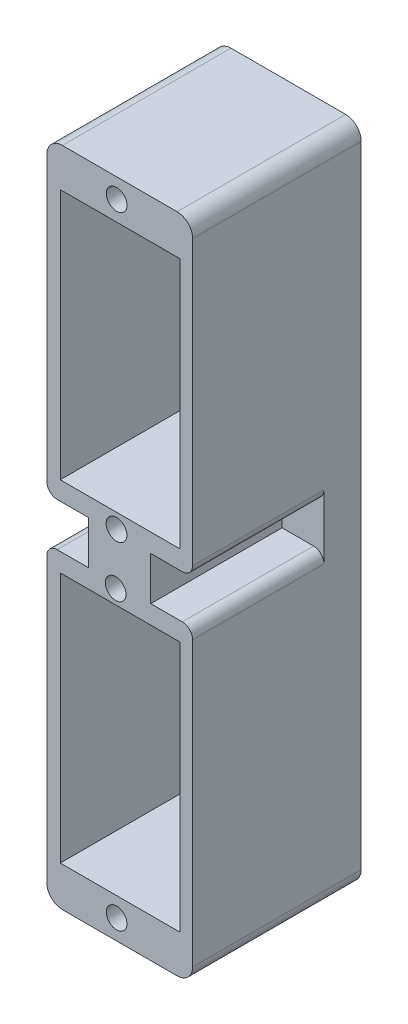
ISO-10303-21;
HEADER;
FILE_DESCRIPTION(('STEP AP214'),'2;1');
FILE_NAME('part.step','',(''),(''),'','','');
FILE_SCHEMA(('AUTOMOTIVE_DESIGN { 1 0 10303 214 1 1 1 1 }'));
ENDSEC;
DATA;
#1=APPLICATION_CONTEXT('core data for automotive mechanical design processes');
#2=APPLICATION_PROTOCOL_DEFINITION('international standard','automotive_design',2000,#1);
#3=PRODUCT_CONTEXT('',#1,'mechanical');
#4=PRODUCT('Part','Part','',(#3));
#5=PRODUCT_RELATED_PRODUCT_CATEGORY('part','',(#4));
#6=PRODUCT_DEFINITION_FORMATION('','',#4);
#7=PRODUCT_DEFINITION_CONTEXT('part definition',#1,'design');
#8=PRODUCT_DEFINITION('design','',#6,#7);
#9=PRODUCT_DEFINITION_SHAPE('','',#8);
#10=(LENGTH_UNIT() NAMED_UNIT(*) SI_UNIT(.MILLI.,.METRE.));
#11=(NAMED_UNIT(*) PLANE_ANGLE_UNIT() SI_UNIT($,.RADIAN.));
#12=(NAMED_UNIT(*) SI_UNIT($,.STERADIAN.) SOLID_ANGLE_UNIT());
#13=UNCERTAINTY_MEASURE_WITH_UNIT(LENGTH_MEASURE(1.E-05),#10,'distance_accuracy_value','');
#14=(GEOMETRIC_REPRESENTATION_CONTEXT(3) GLOBAL_UNCERTAINTY_ASSIGNED_CONTEXT((#13)) GLOBAL_UNIT_ASSIGNED_CONTEXT((#10,
#11,#12)) REPRESENTATION_CONTEXT('',''));
#15=CARTESIAN_POINT('',(0.,0.,0.));
#16=DIRECTION('',(0.,0.,1.));
#17=DIRECTION('',(1.,0.,0.));
#18=AXIS2_PLACEMENT_3D('',#15,#16,#17);
#19=CARTESIAN_POINT('',(-189.836990356445,275.547210693359,46.3));
#20=DIRECTION('',(1.,0.,0.));
#21=DIRECTION('',(0.,0.,-1.));
#22=AXIS2_PLACEMENT_3D('',#19,#20,#21);
#23=PLANE('',#22);
#24=DIRECTION('',(0.,-1.,0.));
#25=VECTOR('',#24,1.);
#26=CARTESIAN_POINT('',(-189.836990356445,275.547210693359,46.3));
#27=LINE('',#26,#25);
#28=CARTESIAN_POINT('',(-189.836990356445,240.447210693359,46.3));
#29=VERTEX_POINT('',#28);
#30=CARTESIAN_POINT('',(-189.836990356445,213.047210693359,46.3));
#31=VERTEX_POINT('',#30);
#32=EDGE_CURVE('E393',#29,#31,#27,.T.);
#33=ORIENTED_EDGE('',*,*,#32,.F.);
#34=DIRECTION('',(0.,0.,1.));
#35=VECTOR('',#34,1.);
#36=CARTESIAN_POINT('',(-189.836990356445,240.447210693359,46.3));
#37=LINE('',#36,#35);
#38=CARTESIAN_POINT('',(-189.836990356445,240.447210693359,33.6));
#39=VERTEX_POINT('',#38);
#40=EDGE_CURVE('E510',#29,#39,#37,.F.);
#41=ORIENTED_EDGE('',*,*,#40,.T.);
#42=DIRECTION('',(0.,-1.,0.));
#43=VECTOR('',#42,1.);
#44=CARTESIAN_POINT('',(-189.836990356445,245.647210693359,33.6));
#45=LINE('',#44,#43);
#46=CARTESIAN_POINT('',(-189.836990356445,246.647210693359,33.6));
#47=VERTEX_POINT('',#46);
#48=EDGE_CURVE('E62',#47,#39,#45,.T.);
#49=ORIENTED_EDGE('',*,*,#48,.F.);
#50=DIRECTION('',(0.,0.,1.));
#51=VECTOR('',#50,1.);
#52=CARTESIAN_POINT('',(-189.836990356445,246.647210693359,46.3));
#53=LINE('',#52,#51);
#54=CARTESIAN_POINT('',(-189.836990356445,246.647210693359,46.3));
#55=VERTEX_POINT('',#54);
#56=EDGE_CURVE('E506',#47,#55,#53,.T.);
#57=ORIENTED_EDGE('',*,*,#56,.T.);
#58=CARTESIAN_POINT('',(-189.836990356445,274.047210693359,46.3));
#59=VERTEX_POINT('',#58);
#60=EDGE_CURVE('E388',#59,#55,#27,.T.);
#61=ORIENTED_EDGE('',*,*,#60,.F.);
#62=DIRECTION('',(0.,0.,-1.));
#63=VECTOR('',#62,1.);
#64=CARTESIAN_POINT('',(-189.836990356445,274.047210693359,46.3));
#65=LINE('',#64,#63);
#66=CARTESIAN_POINT('',(-189.836990356445,274.047210693359,30.));
#67=VERTEX_POINT('',#66);
#68=EDGE_CURVE('E425',#59,#67,#65,.T.);
#69=ORIENTED_EDGE('',*,*,#68,.T.);
#70=DIRECTION('',(0.,-1.,0.));
#71=VECTOR('',#70,1.);
#72=CARTESIAN_POINT('',(-189.836990356445,275.547210693359,30.));
#73=LINE('',#72,#71);
#74=CARTESIAN_POINT('',(-189.836990356445,213.047210693359,30.));
#75=VERTEX_POINT('',#74);
#76=EDGE_CURVE('E336',#67,#75,#73,.T.);
#77=ORIENTED_EDGE('',*,*,#76,.T.);
#78=DIRECTION('',(0.,0.,-1.));
#79=VECTOR('',#78,1.);
#80=CARTESIAN_POINT('',(-189.836990356445,213.047210693359,46.3));
#81=LINE('',#80,#79);
#82=EDGE_CURVE('E406',#75,#31,#81,.F.);
#83=ORIENTED_EDGE('',*,*,#82,.T.);
#84=EDGE_LOOP('',(#33,#41,#49,#57,#61,#69,#77,#83));
#85=FACE_BOUND('',#84,.T.);
#86=ADVANCED_FACE('F39',(#85),#23,.F.);
#87=CARTESIAN_POINT('',(-189.836990356445,211.547210693359,46.3));
#88=DIRECTION('',(0.,1.,0.));
#89=DIRECTION('',(0.,0.,1.));
#90=AXIS2_PLACEMENT_3D('',#87,#88,#89);
#91=PLANE('',#90);
#92=DIRECTION('',(1.,0.,0.));
#93=VECTOR('',#92,1.);
#94=CARTESIAN_POINT('',(-189.836990356445,211.547210693359,46.3));
#95=LINE('',#94,#93);
#96=CARTESIAN_POINT('',(-188.336990356445,211.547210693359,46.3));
#97=VERTEX_POINT('',#96);
#98=CARTESIAN_POINT('',(-177.236990356445,211.547210693359,46.3));
#99=VERTEX_POINT('',#98);
#100=EDGE_CURVE('E392',#97,#99,#95,.T.);
#101=ORIENTED_EDGE('',*,*,#100,.F.);
#102=DIRECTION('',(0.,0.,-1.));
#103=VECTOR('',#102,1.);
#104=CARTESIAN_POINT('',(-188.336990356445,211.547210693359,46.3));
#105=LINE('',#104,#103);
#106=CARTESIAN_POINT('',(-188.336990356445,211.547210693359,30.));
#107=VERTEX_POINT('',#106);
#108=EDGE_CURVE('E471',#97,#107,#105,.T.);
#109=ORIENTED_EDGE('',*,*,#108,.T.);
#110=DIRECTION('',(1.,0.,0.));
#111=VECTOR('',#110,1.);
#112=CARTESIAN_POINT('',(-189.836990356445,211.547210693359,30.));
#113=LINE('',#112,#111);
#114=CARTESIAN_POINT('',(-177.236990356445,211.547210693359,30.));
#115=VERTEX_POINT('',#114);
#116=EDGE_CURVE('E410',#107,#115,#113,.T.);
#117=ORIENTED_EDGE('',*,*,#116,.T.);
#118=DIRECTION('',(0.,0.,-1.));
#119=VECTOR('',#118,1.);
#120=CARTESIAN_POINT('',(-177.236990356445,211.547210693359,46.3));
#121=LINE('',#120,#119);
#122=EDGE_CURVE('E468',#115,#99,#121,.F.);
#123=ORIENTED_EDGE('',*,*,#122,.T.);
#124=EDGE_LOOP('',(#101,#109,#117,#123));
#125=FACE_BOUND('',#124,.T.);
#126=ADVANCED_FACE('F576',(#125),#91,.F.);
#127=CARTESIAN_POINT('',(-175.736990356445,275.547210693359,46.3));
#128=DIRECTION('',(-1.,0.,0.));
#129=DIRECTION('',(0.,0.,1.));
#130=AXIS2_PLACEMENT_3D('',#127,#128,#129);
#131=PLANE('',#130);
#132=DIRECTION('',(0.,1.,0.));
#133=VECTOR('',#132,1.);
#134=CARTESIAN_POINT('',(-175.736990356445,245.647210693359,33.6));
#135=LINE('',#134,#133);
#136=CARTESIAN_POINT('',(-175.736990356445,240.447210693359,33.6));
#137=VERTEX_POINT('',#136);
#138=CARTESIAN_POINT('',(-175.736990356445,246.647210693359,33.6));
#139=VERTEX_POINT('',#138);
#140=EDGE_CURVE('E277',#137,#139,#135,.T.);
#141=ORIENTED_EDGE('',*,*,#140,.F.);
#142=DIRECTION('',(0.,0.,1.));
#143=VECTOR('',#142,1.);
#144=CARTESIAN_POINT('',(-175.736990356445,240.447210693359,46.3));
#145=LINE('',#144,#143);
#146=CARTESIAN_POINT('',(-175.736990356445,240.447210693359,46.3));
#147=VERTEX_POINT('',#146);
#148=EDGE_CURVE('E479',#137,#147,#145,.T.);
#149=ORIENTED_EDGE('',*,*,#148,.T.);
#150=DIRECTION('',(0.,1.,0.));
#151=VECTOR('',#150,1.);
#152=CARTESIAN_POINT('',(-175.736990356445,275.547210693359,46.3));
#153=LINE('',#152,#151);
#154=CARTESIAN_POINT('',(-175.736990356445,213.047210693359,46.3));
#155=VERTEX_POINT('',#154);
#156=EDGE_CURVE('E398',#155,#147,#153,.T.);
#157=ORIENTED_EDGE('',*,*,#156,.F.);
#158=DIRECTION('',(0.,0.,-1.));
#159=VECTOR('',#158,1.);
#160=CARTESIAN_POINT('',(-175.736990356445,213.047210693359,46.3));
#161=LINE('',#160,#159);
#162=CARTESIAN_POINT('',(-175.736990356445,213.047210693359,30.));
#163=VERTEX_POINT('',#162);
#164=EDGE_CURVE('E460',#155,#163,#161,.T.);
#165=ORIENTED_EDGE('',*,*,#164,.T.);
#166=DIRECTION('',(0.,1.,0.));
#167=VECTOR('',#166,1.);
#168=CARTESIAN_POINT('',(-175.736990356445,275.547210693359,30.));
#169=LINE('',#168,#167);
#170=CARTESIAN_POINT('',(-175.736990356445,274.047210693359,30.));
#171=VERTEX_POINT('',#170);
#172=EDGE_CURVE('E414',#163,#171,#169,.T.);
#173=ORIENTED_EDGE('',*,*,#172,.T.);
#174=DIRECTION('',(0.,0.,-1.));
#175=VECTOR('',#174,1.);
#176=CARTESIAN_POINT('',(-175.736990356445,274.047210693359,46.3));
#177=LINE('',#176,#175);
#178=CARTESIAN_POINT('',(-175.736990356445,274.047210693359,46.3));
#179=VERTEX_POINT('',#178);
#180=EDGE_CURVE('E464',#171,#179,#177,.F.);
#181=ORIENTED_EDGE('',*,*,#180,.T.);
#182=CARTESIAN_POINT('',(-175.736990356445,246.647210693359,46.3));
#183=VERTEX_POINT('',#182);
#184=EDGE_CURVE('E397',#183,#179,#153,.T.);
#185=ORIENTED_EDGE('',*,*,#184,.F.);
#186=DIRECTION('',(0.,0.,1.));
#187=VECTOR('',#186,1.);
#188=CARTESIAN_POINT('',(-175.736990356445,246.647210693359,46.3));
#189=LINE('',#188,#187);
#190=EDGE_CURVE('E475',#183,#139,#189,.F.);
#191=ORIENTED_EDGE('',*,*,#190,.T.);
#192=EDGE_LOOP('',(#141,#149,#157,#165,#173,#181,#185,#191));
#193=FACE_BOUND('',#192,.T.);
#194=ADVANCED_FACE('F546',(#193),#131,.F.);
#195=CARTESIAN_POINT('',(-189.836990356445,275.547210693359,46.3));
#196=DIRECTION('',(0.,-1.,0.));
#197=DIRECTION('',(0.,0.,-1.));
#198=AXIS2_PLACEMENT_3D('',#195,#196,#197);
#199=PLANE('',#198);
#200=DIRECTION('',(-1.,0.,0.));
#201=VECTOR('',#200,1.);
#202=CARTESIAN_POINT('',(-189.836990356445,275.547210693359,30.));
#203=LINE('',#202,#201);
#204=CARTESIAN_POINT('',(-177.236990356445,275.547210693359,30.));
#205=VERTEX_POINT('',#204);
#206=CARTESIAN_POINT('',(-188.336990356445,275.547210693359,30.));
#207=VERTEX_POINT('',#206);
#208=EDGE_CURVE('E418',#205,#207,#203,.T.);
#209=ORIENTED_EDGE('',*,*,#208,.T.);
#210=DIRECTION('',(0.,0.,-1.));
#211=VECTOR('',#210,1.);
#212=CARTESIAN_POINT('',(-188.336990356445,275.547210693359,46.3));
#213=LINE('',#212,#211);
#214=CARTESIAN_POINT('',(-188.336990356445,275.547210693359,46.3));
#215=VERTEX_POINT('',#214);
#216=EDGE_CURVE('E445',#207,#215,#213,.F.);
#217=ORIENTED_EDGE('',*,*,#216,.T.);
#218=DIRECTION('',(-1.,0.,0.));
#219=VECTOR('',#218,1.);
#220=CARTESIAN_POINT('',(-189.836990356445,275.547210693359,46.3));
#221=LINE('',#220,#219);
#222=CARTESIAN_POINT('',(-177.236990356445,275.547210693359,46.3));
#223=VERTEX_POINT('',#222);
#224=EDGE_CURVE('E402',#223,#215,#221,.T.);
#225=ORIENTED_EDGE('',*,*,#224,.F.);
#226=DIRECTION('',(0.,0.,-1.));
#227=VECTOR('',#226,1.);
#228=CARTESIAN_POINT('',(-177.236990356445,275.547210693359,46.3));
#229=LINE('',#228,#227);
#230=EDGE_CURVE('E441',#223,#205,#229,.T.);
#231=ORIENTED_EDGE('',*,*,#230,.T.);
#232=EDGE_LOOP('',(#209,#217,#225,#231));
#233=FACE_BOUND('',#232,.T.);
#234=ADVANCED_FACE('F553',(#233),#199,.F.);
#235=CARTESIAN_POINT('',(0.,0.,46.3));
#236=DIRECTION('',(0.,0.,1.));
#237=DIRECTION('',(1.,0.,0.));
#238=AXIS2_PLACEMENT_3D('',#235,#236,#237);
#239=PLANE('',#238);
#240=CARTESIAN_POINT('',(-183.086103711404,273.651926581653,46.3));
#241=DIRECTION('',(0.,0.,1.));
#242=DIRECTION('',(1.,0.,0.));
#243=AXIS2_PLACEMENT_3D('',#240,#241,#242);
#244=CIRCLE('',#243,0.999999999999998);
#245=CARTESIAN_POINT('',(-182.086103711404,273.651926581653,46.3));
#246=VERTEX_POINT('',#245);
#247=EDGE_CURVE('E902',#246,#246,#244,.T.);
#248=ORIENTED_EDGE('',*,*,#247,.F.);
#249=EDGE_LOOP('',(#248));
#250=FACE_BOUND('',#249,.T.);
#251=CARTESIAN_POINT('',(-183.18196105957,241.016693115234,46.3));
#252=DIRECTION('',(0.,0.,1.));
#253=DIRECTION('',(1.,0.,0.));
#254=AXIS2_PLACEMENT_3D('',#251,#252,#253);
#255=CIRCLE('',#254,0.999999999999998);
#256=CARTESIAN_POINT('',(-182.18196105957,241.016693115234,46.3));
#257=VERTEX_POINT('',#256);
#258=EDGE_CURVE('E917',#257,#257,#255,.T.);
#259=ORIENTED_EDGE('',*,*,#258,.F.);
#260=EDGE_LOOP('',(#259));
#261=FACE_BOUND('',#260,.T.);
#262=CARTESIAN_POINT('',(-183.098908315797,246.016003291824,46.3));
#263=DIRECTION('',(0.,0.,1.));
#264=DIRECTION('',(1.,0.,0.));
#265=AXIS2_PLACEMENT_3D('',#262,#263,#264);
#266=CIRCLE('',#265,0.999999999999998);
#267=CARTESIAN_POINT('',(-182.098908315797,246.016003291824,46.3));
#268=VERTEX_POINT('',#267);
#269=EDGE_CURVE('E253',#268,#268,#266,.T.);
#270=ORIENTED_EDGE('',*,*,#269,.F.);
#271=EDGE_LOOP('',(#270));
#272=FACE_BOUND('',#271,.T.);
#273=CARTESIAN_POINT('',(-183.086103711404,213.475534384187,46.3));
#274=DIRECTION('',(0.,0.,1.));
#275=DIRECTION('',(1.,0.,0.));
#276=AXIS2_PLACEMENT_3D('',#273,#274,#275);
#277=CIRCLE('',#276,0.999999999999998);
#278=CARTESIAN_POINT('',(-182.086103711404,213.475534384187,46.3));
#279=VERTEX_POINT('',#278);
#280=EDGE_CURVE('E910',#279,#279,#277,.T.);
#281=ORIENTED_EDGE('',*,*,#280,.F.);
#282=EDGE_LOOP('',(#281));
#283=FACE_BOUND('',#282,.T.);
#284=ORIENTED_EDGE('',*,*,#156,.T.);
#285=CARTESIAN_POINT('',(-176.736990356445,240.447210693359,46.3));
#286=DIRECTION('',(0.,0.,1.));
#287=DIRECTION('',(1.,0.,0.));
#288=AXIS2_PLACEMENT_3D('',#285,#286,#287);
#289=CIRCLE('',#288,1.);
#290=CARTESIAN_POINT('',(-176.736990356445,241.447210693359,46.3));
#291=VERTEX_POINT('',#290);
#292=EDGE_CURVE('E492',#147,#291,#289,.T.);
#293=ORIENTED_EDGE('',*,*,#292,.T.);
#294=DIRECTION('',(1.,0.,0.));
#295=VECTOR('',#294,1.);
#296=CARTESIAN_POINT('',(-179.786990356445,241.447210693359,46.3));
#297=LINE('',#296,#295);
#298=CARTESIAN_POINT('',(-179.786990356445,241.447210693359,46.3));
#299=VERTEX_POINT('',#298);
#300=EDGE_CURVE('E287',#299,#291,#297,.T.);
#301=ORIENTED_EDGE('',*,*,#300,.F.);
#302=DIRECTION('',(0.,-1.,0.));
#303=VECTOR('',#302,1.);
#304=CARTESIAN_POINT('',(-179.786990356445,245.647210693359,46.3));
#305=LINE('',#304,#303);
#306=CARTESIAN_POINT('',(-179.786990356445,245.647210693359,46.3));
#307=VERTEX_POINT('',#306);
#308=EDGE_CURVE('E284',#307,#299,#305,.T.);
#309=ORIENTED_EDGE('',*,*,#308,.F.);
#310=DIRECTION('',(-1.,0.,0.));
#311=VECTOR('',#310,1.);
#312=CARTESIAN_POINT('',(-179.786990356445,245.647210693359,46.3));
#313=LINE('',#312,#311);
#314=CARTESIAN_POINT('',(-176.736990356445,245.647210693359,46.3));
#315=VERTEX_POINT('',#314);
#316=EDGE_CURVE('E273',#315,#307,#313,.T.);
#317=ORIENTED_EDGE('',*,*,#316,.F.);
#318=CARTESIAN_POINT('',(-176.736990356445,246.647210693359,46.3));
#319=DIRECTION('',(0.,0.,1.));
#320=DIRECTION('',(1.,0.,0.));
#321=AXIS2_PLACEMENT_3D('',#318,#319,#320);
#322=CIRCLE('',#321,1.);
#323=EDGE_CURVE('E489',#315,#183,#322,.T.);
#324=ORIENTED_EDGE('',*,*,#323,.T.);
#325=ORIENTED_EDGE('',*,*,#184,.T.);
#326=CARTESIAN_POINT('',(-177.236990356445,274.047210693359,46.3));
#327=DIRECTION('',(0.,0.,1.));
#328=DIRECTION('',(1.,0.,0.));
#329=AXIS2_PLACEMENT_3D('',#326,#327,#328);
#330=CIRCLE('',#329,1.5);
#331=EDGE_CURVE('E454',#179,#223,#330,.T.);
#332=ORIENTED_EDGE('',*,*,#331,.T.);
#333=ORIENTED_EDGE('',*,*,#224,.T.);
#334=CARTESIAN_POINT('',(-188.336990356445,274.047210693359,46.3));
#335=DIRECTION('',(0.,0.,1.));
#336=DIRECTION('',(1.,0.,0.));
#337=AXIS2_PLACEMENT_3D('',#334,#335,#336);
#338=CIRCLE('',#337,1.5);
#339=EDGE_CURVE('E457',#215,#59,#338,.T.);
#340=ORIENTED_EDGE('',*,*,#339,.T.);
#341=ORIENTED_EDGE('',*,*,#60,.T.);
#342=CARTESIAN_POINT('',(-188.836990356445,246.647210693359,46.3));
#343=DIRECTION('',(0.,0.,1.));
#344=DIRECTION('',(1.,0.,0.));
#345=AXIS2_PLACEMENT_3D('',#342,#343,#344);
#346=CIRCLE('',#345,1.);
#347=CARTESIAN_POINT('',(-188.836990356445,245.647210693359,46.3));
#348=VERTEX_POINT('',#347);
#349=EDGE_CURVE('E483',#55,#348,#346,.T.);
#350=ORIENTED_EDGE('',*,*,#349,.T.);
#351=DIRECTION('',(-1.,0.,0.));
#352=VECTOR('',#351,1.);
#353=CARTESIAN_POINT('',(-185.786990356445,245.647210693359,46.3));
#354=LINE('',#353,#352);
#355=CARTESIAN_POINT('',(-185.786990356445,245.647210693359,46.3));
#356=VERTEX_POINT('',#355);
#357=EDGE_CURVE('E250',#356,#348,#354,.T.);
#358=ORIENTED_EDGE('',*,*,#357,.F.);
#359=DIRECTION('',(0.,1.,0.));
#360=VECTOR('',#359,1.);
#361=CARTESIAN_POINT('',(-185.786990356445,245.647210693359,46.3));
#362=LINE('',#361,#360);
#363=CARTESIAN_POINT('',(-185.786990356445,241.447210693359,46.3));
#364=VERTEX_POINT('',#363);
#365=EDGE_CURVE('E232',#364,#356,#362,.T.);
#366=ORIENTED_EDGE('',*,*,#365,.F.);
#367=DIRECTION('',(1.,0.,0.));
#368=VECTOR('',#367,1.);
#369=CARTESIAN_POINT('',(-185.786990356445,241.447210693359,46.3));
#370=LINE('',#369,#368);
#371=CARTESIAN_POINT('',(-188.836990356445,241.447210693359,46.3));
#372=VERTEX_POINT('',#371);
#373=EDGE_CURVE('E247',#372,#364,#370,.T.);
#374=ORIENTED_EDGE('',*,*,#373,.F.);
#375=CARTESIAN_POINT('',(-188.836990356445,240.447210693359,46.3));
#376=DIRECTION('',(0.,0.,1.));
#377=DIRECTION('',(1.,0.,0.));
#378=AXIS2_PLACEMENT_3D('',#375,#376,#377);
#379=CIRCLE('',#378,1.);
#380=EDGE_CURVE('E486',#372,#29,#379,.T.);
#381=ORIENTED_EDGE('',*,*,#380,.T.);
#382=ORIENTED_EDGE('',*,*,#32,.T.);
#383=CARTESIAN_POINT('',(-188.336990356445,213.047210693359,46.3));
#384=DIRECTION('',(0.,0.,1.));
#385=DIRECTION('',(1.,0.,0.));
#386=AXIS2_PLACEMENT_3D('',#383,#384,#385);
#387=CIRCLE('',#386,1.5);
#388=EDGE_CURVE('E451',#31,#97,#387,.T.);
#389=ORIENTED_EDGE('',*,*,#388,.T.);
#390=ORIENTED_EDGE('',*,*,#100,.T.);
#391=CARTESIAN_POINT('',(-177.236990356445,213.047210693359,46.3));
#392=DIRECTION('',(0.,0.,1.));
#393=DIRECTION('',(1.,0.,0.));
#394=AXIS2_PLACEMENT_3D('',#391,#392,#393);
#395=CIRCLE('',#394,1.5);
#396=EDGE_CURVE('E448',#99,#155,#395,.T.);
#397=ORIENTED_EDGE('',*,*,#396,.T.);
#398=EDGE_LOOP('',(#284,#293,#301,#309,#317,#324,#325,#332,#333,#340,#341,#350,#358,#366,#374,
#381,#382,#389,#390,#397));
#399=FACE_BOUND('',#398,.T.);
#400=DIRECTION('',(0.,-1.,0.));
#401=VECTOR('',#400,1.);
#402=CARTESIAN_POINT('',(-188.536990356445,271.747210693359,46.3));
#403=LINE('',#402,#401);
#404=CARTESIAN_POINT('',(-188.536990356445,271.747210693359,46.3));
#405=VERTEX_POINT('',#404);
#406=CARTESIAN_POINT('',(-188.536990356445,247.447210693359,46.3));
#407=VERTEX_POINT('',#406);
#408=EDGE_CURVE('E318',#405,#407,#403,.T.);
#409=ORIENTED_EDGE('',*,*,#408,.F.);
#410=DIRECTION('',(-1.,0.,0.));
#411=VECTOR('',#410,1.);
#412=CARTESIAN_POINT('',(-188.536990356445,271.747210693359,46.3));
#413=LINE('',#412,#411);
#414=CARTESIAN_POINT('',(-176.936990356445,271.747210693359,46.3));
#415=VERTEX_POINT('',#414);
#416=EDGE_CURVE('E305',#415,#405,#413,.T.);
#417=ORIENTED_EDGE('',*,*,#416,.F.);
#418=DIRECTION('',(0.,1.,0.));
#419=VECTOR('',#418,1.);
#420=CARTESIAN_POINT('',(-176.936990356445,271.747210693359,46.3));
#421=LINE('',#420,#419);
#422=CARTESIAN_POINT('',(-176.936990356445,247.447210693359,46.3));
#423=VERTEX_POINT('',#422);
#424=EDGE_CURVE('E326',#423,#415,#421,.T.);
#425=ORIENTED_EDGE('',*,*,#424,.F.);
#426=DIRECTION('',(1.,0.,0.));
#427=VECTOR('',#426,1.);
#428=CARTESIAN_POINT('',(-188.536990356445,247.447210693359,46.3));
#429=LINE('',#428,#427);
#430=EDGE_CURVE('E321',#407,#423,#429,.T.);
#431=ORIENTED_EDGE('',*,*,#430,.F.);
#432=EDGE_LOOP('',(#409,#417,#425,#431));
#433=FACE_BOUND('',#432,.T.);
#434=DIRECTION('',(0.,-1.,0.));
#435=VECTOR('',#434,1.);
#436=CARTESIAN_POINT('',(-188.536990356445,239.647210693359,46.3));
#437=LINE('',#436,#435);
#438=CARTESIAN_POINT('',(-188.536990356445,239.647210693359,46.3));
#439=VERTEX_POINT('',#438);
#440=CARTESIAN_POINT('',(-188.536990356445,215.347210693359,46.3));
#441=VERTEX_POINT('',#440);
#442=EDGE_CURVE('E266',#439,#441,#437,.T.);
#443=ORIENTED_EDGE('',*,*,#442,.F.);
#444=DIRECTION('',(-1.,0.,0.));
#445=VECTOR('',#444,1.);
#446=CARTESIAN_POINT('',(-188.536990356445,239.647210693359,46.3));
#447=LINE('',#446,#445);
#448=CARTESIAN_POINT('',(-176.936990356445,239.647210693359,46.3));
#449=VERTEX_POINT('',#448);
#450=EDGE_CURVE('E351',#449,#439,#447,.T.);
#451=ORIENTED_EDGE('',*,*,#450,.F.);
#452=DIRECTION('',(0.,1.,0.));
#453=VECTOR('',#452,1.);
#454=CARTESIAN_POINT('',(-176.936990356445,239.647210693359,46.3));
#455=LINE('',#454,#453);
#456=CARTESIAN_POINT('',(-176.936990356445,215.347210693359,46.3));
#457=VERTEX_POINT('',#456);
#458=EDGE_CURVE('E370',#457,#449,#455,.T.);
#459=ORIENTED_EDGE('',*,*,#458,.F.);
#460=DIRECTION('',(1.,0.,0.));
#461=VECTOR('',#460,1.);
#462=CARTESIAN_POINT('',(-188.536990356445,215.347210693359,46.3));
#463=LINE('',#462,#461);
#464=EDGE_CURVE('E366',#441,#457,#463,.T.);
#465=ORIENTED_EDGE('',*,*,#464,.F.);
#466=EDGE_LOOP('',(#443,#451,#459,#465));
#467=FACE_BOUND('',#466,.T.);
#468=ADVANCED_FACE('F532',(#250,#261,#272,#283,#399,#433,#467),#239,.T.);
#469=CARTESIAN_POINT('',(0.,0.,30.));
#470=DIRECTION('',(0.,0.,1.));
#471=DIRECTION('',(1.,0.,0.));
#472=AXIS2_PLACEMENT_3D('',#469,#470,#471);
#473=PLANE('',#472);
#474=CARTESIAN_POINT('',(-183.086103711404,273.651926581653,30.));
#475=DIRECTION('',(0.,0.,1.));
#476=DIRECTION('',(1.,0.,0.));
#477=AXIS2_PLACEMENT_3D('',#474,#475,#476);
#478=CIRCLE('',#477,0.999999999999998);
#479=CARTESIAN_POINT('',(-182.086103711404,273.651926581653,30.));
#480=VERTEX_POINT('',#479);
#481=EDGE_CURVE('E288',#480,#480,#478,.T.);
#482=ORIENTED_EDGE('',*,*,#481,.T.);
#483=EDGE_LOOP('',(#482));
#484=FACE_BOUND('',#483,.T.);
#485=CARTESIAN_POINT('',(-183.18196105957,241.016693115234,30.));
#486=DIRECTION('',(0.,0.,1.));
#487=DIRECTION('',(1.,0.,0.));
#488=AXIS2_PLACEMENT_3D('',#485,#486,#487);
#489=CIRCLE('',#488,0.999999999999998);
#490=CARTESIAN_POINT('',(-182.18196105957,241.016693115234,30.));
#491=VERTEX_POINT('',#490);
#492=EDGE_CURVE('E913',#491,#491,#489,.T.);
#493=ORIENTED_EDGE('',*,*,#492,.T.);
#494=EDGE_LOOP('',(#493));
#495=FACE_BOUND('',#494,.T.);
#496=CARTESIAN_POINT('',(-183.098908315797,246.016003291824,30.));
#497=DIRECTION('',(0.,0.,1.));
#498=DIRECTION('',(1.,0.,0.));
#499=AXIS2_PLACEMENT_3D('',#496,#497,#498);
#500=CIRCLE('',#499,0.999999999999998);
#501=CARTESIAN_POINT('',(-182.098908315797,246.016003291824,30.));
#502=VERTEX_POINT('',#501);
#503=EDGE_CURVE('E923',#502,#502,#500,.T.);
#504=ORIENTED_EDGE('',*,*,#503,.T.);
#505=EDGE_LOOP('',(#504));
#506=FACE_BOUND('',#505,.T.);
#507=CARTESIAN_POINT('',(-183.086103711404,213.475534384187,30.));
#508=DIRECTION('',(0.,0.,1.));
#509=DIRECTION('',(1.,0.,0.));
#510=AXIS2_PLACEMENT_3D('',#507,#508,#509);
#511=CIRCLE('',#510,0.999999999999998);
#512=CARTESIAN_POINT('',(-182.086103711404,213.475534384187,30.));
#513=VERTEX_POINT('',#512);
#514=EDGE_CURVE('E904',#513,#513,#511,.T.);
#515=ORIENTED_EDGE('',*,*,#514,.T.);
#516=EDGE_LOOP('',(#515));
#517=FACE_BOUND('',#516,.T.);
#518=DIRECTION('',(-1.,0.,0.));
#519=VECTOR('',#518,1.);
#520=CARTESIAN_POINT('',(-188.536990356445,271.747210693359,30.));
#521=LINE('',#520,#519);
#522=CARTESIAN_POINT('',(-176.936990356445,271.747210693359,30.));
#523=VERTEX_POINT('',#522);
#524=CARTESIAN_POINT('',(-188.536990356445,271.747210693359,30.));
#525=VERTEX_POINT('',#524);
#526=EDGE_CURVE('E313',#523,#525,#521,.T.);
#527=ORIENTED_EDGE('',*,*,#526,.T.);
#528=DIRECTION('',(0.,-1.,0.));
#529=VECTOR('',#528,1.);
#530=CARTESIAN_POINT('',(-188.536990356445,271.747210693359,30.));
#531=LINE('',#530,#529);
#532=CARTESIAN_POINT('',(-188.536990356445,247.447210693359,30.));
#533=VERTEX_POINT('',#532);
#534=EDGE_CURVE('E300',#525,#533,#531,.T.);
#535=ORIENTED_EDGE('',*,*,#534,.T.);
#536=DIRECTION('',(1.,0.,0.));
#537=VECTOR('',#536,1.);
#538=CARTESIAN_POINT('',(-188.536990356445,247.447210693359,30.));
#539=LINE('',#538,#537);
#540=CARTESIAN_POINT('',(-176.936990356445,247.447210693359,30.));
#541=VERTEX_POINT('',#540);
#542=EDGE_CURVE('E304',#533,#541,#539,.T.);
#543=ORIENTED_EDGE('',*,*,#542,.T.);
#544=DIRECTION('',(0.,1.,0.));
#545=VECTOR('',#544,1.);
#546=CARTESIAN_POINT('',(-176.936990356445,271.747210693359,30.));
#547=LINE('',#546,#545);
#548=EDGE_CURVE('E309',#541,#523,#547,.T.);
#549=ORIENTED_EDGE('',*,*,#548,.T.);
#550=EDGE_LOOP('',(#527,#535,#543,#549));
#551=FACE_BOUND('',#550,.T.);
#552=DIRECTION('',(-1.,0.,0.));
#553=VECTOR('',#552,1.);
#554=CARTESIAN_POINT('',(-188.536990356445,239.647210693359,30.));
#555=LINE('',#554,#553);
#556=CARTESIAN_POINT('',(-176.936990356445,239.647210693359,30.));
#557=VERTEX_POINT('',#556);
#558=CARTESIAN_POINT('',(-188.536990356445,239.647210693359,30.));
#559=VERTEX_POINT('',#558);
#560=EDGE_CURVE('E359',#557,#559,#555,.T.);
#561=ORIENTED_EDGE('',*,*,#560,.T.);
#562=DIRECTION('',(0.,-1.,0.));
#563=VECTOR('',#562,1.);
#564=CARTESIAN_POINT('',(-188.536990356445,239.647210693359,30.));
#565=LINE('',#564,#563);
#566=CARTESIAN_POINT('',(-188.536990356445,215.347210693359,30.));
#567=VERTEX_POINT('',#566);
#568=EDGE_CURVE('E346',#559,#567,#565,.T.);
#569=ORIENTED_EDGE('',*,*,#568,.T.);
#570=DIRECTION('',(1.,0.,0.));
#571=VECTOR('',#570,1.);
#572=CARTESIAN_POINT('',(-188.536990356445,215.347210693359,30.));
#573=LINE('',#572,#571);
#574=CARTESIAN_POINT('',(-176.936990356445,215.347210693359,30.));
#575=VERTEX_POINT('',#574);
#576=EDGE_CURVE('E350',#567,#575,#573,.T.);
#577=ORIENTED_EDGE('',*,*,#576,.T.);
#578=DIRECTION('',(0.,1.,0.));
#579=VECTOR('',#578,1.);
#580=CARTESIAN_POINT('',(-176.936990356445,239.647210693359,30.));
#581=LINE('',#580,#579);
#582=EDGE_CURVE('E355',#575,#557,#581,.T.);
#583=ORIENTED_EDGE('',*,*,#582,.T.);
#584=EDGE_LOOP('',(#561,#569,#577,#583));
#585=FACE_BOUND('',#584,.T.);
#586=ORIENTED_EDGE('',*,*,#76,.F.);
#587=CARTESIAN_POINT('',(-188.336990356445,274.047210693359,30.));
#588=DIRECTION('',(0.,0.,1.));
#589=DIRECTION('',(1.,0.,0.));
#590=AXIS2_PLACEMENT_3D('',#587,#588,#589);
#591=CIRCLE('',#590,1.5);
#592=EDGE_CURVE('E438',#67,#207,#591,.F.);
#593=ORIENTED_EDGE('',*,*,#592,.T.);
#594=ORIENTED_EDGE('',*,*,#208,.F.);
#595=CARTESIAN_POINT('',(-177.236990356445,274.047210693359,30.));
#596=DIRECTION('',(0.,0.,1.));
#597=DIRECTION('',(1.,0.,0.));
#598=AXIS2_PLACEMENT_3D('',#595,#596,#597);
#599=CIRCLE('',#598,1.5);
#600=EDGE_CURVE('E435',#205,#171,#599,.F.);
#601=ORIENTED_EDGE('',*,*,#600,.T.);
#602=ORIENTED_EDGE('',*,*,#172,.F.);
#603=CARTESIAN_POINT('',(-177.236990356445,213.047210693359,30.));
#604=DIRECTION('',(0.,0.,1.));
#605=DIRECTION('',(1.,0.,0.));
#606=AXIS2_PLACEMENT_3D('',#603,#604,#605);
#607=CIRCLE('',#606,1.5);
#608=EDGE_CURVE('E429',#163,#115,#607,.F.);
#609=ORIENTED_EDGE('',*,*,#608,.T.);
#610=ORIENTED_EDGE('',*,*,#116,.F.);
#611=CARTESIAN_POINT('',(-188.336990356445,213.047210693359,30.));
#612=DIRECTION('',(0.,0.,1.));
#613=DIRECTION('',(1.,0.,0.));
#614=AXIS2_PLACEMENT_3D('',#611,#612,#613);
#615=CIRCLE('',#614,1.5);
#616=EDGE_CURVE('E432',#107,#75,#615,.F.);
#617=ORIENTED_EDGE('',*,*,#616,.T.);
#618=EDGE_LOOP('',(#586,#593,#594,#601,#602,#609,#610,#617));
#619=FACE_BOUND('',#618,.T.);
#620=ADVANCED_FACE('F557',(#484,#495,#506,#517,#551,#585,#619),#473,.F.);
#621=CARTESIAN_POINT('',(-188.336990356445,274.047210693359,46.3));
#622=DIRECTION('',(0.,0.,-1.));
#623=DIRECTION('',(-1.,0.,0.));
#624=AXIS2_PLACEMENT_3D('',#621,#622,#623);
#625=CYLINDRICAL_SURFACE('',#624,1.5);
#626=ORIENTED_EDGE('',*,*,#339,.F.);
#627=ORIENTED_EDGE('',*,*,#216,.F.);
#628=ORIENTED_EDGE('',*,*,#592,.F.);
#629=ORIENTED_EDGE('',*,*,#68,.F.);
#630=EDGE_LOOP('',(#626,#627,#628,#629));
#631=FACE_BOUND('',#630,.T.);
#632=ADVANCED_FACE('F561',(#631),#625,.T.);
#633=CARTESIAN_POINT('',(-177.236990356445,274.047210693359,46.3));
#634=DIRECTION('',(0.,0.,-1.));
#635=DIRECTION('',(-1.,0.,0.));
#636=AXIS2_PLACEMENT_3D('',#633,#634,#635);
#637=CYLINDRICAL_SURFACE('',#636,1.5);
#638=ORIENTED_EDGE('',*,*,#331,.F.);
#639=ORIENTED_EDGE('',*,*,#180,.F.);
#640=ORIENTED_EDGE('',*,*,#600,.F.);
#641=ORIENTED_EDGE('',*,*,#230,.F.);
#642=EDGE_LOOP('',(#638,#639,#640,#641));
#643=FACE_BOUND('',#642,.T.);
#644=ADVANCED_FACE('F550',(#643),#637,.T.);
#645=CARTESIAN_POINT('',(-188.336990356445,213.047210693359,46.3));
#646=DIRECTION('',(0.,0.,-1.));
#647=DIRECTION('',(-1.,0.,0.));
#648=AXIS2_PLACEMENT_3D('',#645,#646,#647);
#649=CYLINDRICAL_SURFACE('',#648,1.5);
#650=ORIENTED_EDGE('',*,*,#388,.F.);
#651=ORIENTED_EDGE('',*,*,#82,.F.);
#652=ORIENTED_EDGE('',*,*,#616,.F.);
#653=ORIENTED_EDGE('',*,*,#108,.F.);
#654=EDGE_LOOP('',(#650,#651,#652,#653));
#655=FACE_BOUND('',#654,.T.);
#656=ADVANCED_FACE('F589',(#655),#649,.T.);
#657=CARTESIAN_POINT('',(-177.236990356445,213.047210693359,46.3));
#658=DIRECTION('',(0.,0.,-1.));
#659=DIRECTION('',(-1.,0.,0.));
#660=AXIS2_PLACEMENT_3D('',#657,#658,#659);
#661=CYLINDRICAL_SURFACE('',#660,1.5);
#662=ORIENTED_EDGE('',*,*,#396,.F.);
#663=ORIENTED_EDGE('',*,*,#122,.F.);
#664=ORIENTED_EDGE('',*,*,#608,.F.);
#665=ORIENTED_EDGE('',*,*,#164,.F.);
#666=EDGE_LOOP('',(#662,#663,#664,#665));
#667=FACE_BOUND('',#666,.T.);
#668=ADVANCED_FACE('F592',(#667),#661,.T.);
#669=CARTESIAN_POINT('',(-188.536990356445,239.647210693359,30.));
#670=DIRECTION('',(-1.,0.,0.));
#671=DIRECTION('',(0.,0.,1.));
#672=AXIS2_PLACEMENT_3D('',#669,#670,#671);
#673=PLANE('',#672);
#674=ORIENTED_EDGE('',*,*,#442,.T.);
#675=DIRECTION('',(0.,0.,1.));
#676=VECTOR('',#675,1.);
#677=CARTESIAN_POINT('',(-188.536990356445,215.347210693359,30.));
#678=LINE('',#677,#676);
#679=EDGE_CURVE('E363',#567,#441,#678,.T.);
#680=ORIENTED_EDGE('',*,*,#679,.F.);
#681=ORIENTED_EDGE('',*,*,#568,.F.);
#682=DIRECTION('',(0.,0.,1.));
#683=VECTOR('',#682,1.);
#684=CARTESIAN_POINT('',(-188.536990356445,239.647210693359,30.));
#685=LINE('',#684,#683);
#686=EDGE_CURVE('E322',#559,#439,#685,.T.);
#687=ORIENTED_EDGE('',*,*,#686,.T.);
#688=EDGE_LOOP('',(#674,#680,#681,#687));
#689=FACE_BOUND('',#688,.T.);
#690=ADVANCED_FACE('F596',(#689),#673,.F.);
#691=CARTESIAN_POINT('',(-188.536990356445,239.647210693359,30.));
#692=DIRECTION('',(0.,1.,0.));
#693=DIRECTION('',(0.,0.,1.));
#694=AXIS2_PLACEMENT_3D('',#691,#692,#693);
#695=PLANE('',#694);
#696=ORIENTED_EDGE('',*,*,#450,.T.);
#697=ORIENTED_EDGE('',*,*,#686,.F.);
#698=ORIENTED_EDGE('',*,*,#560,.F.);
#699=DIRECTION('',(0.,0.,1.));
#700=VECTOR('',#699,1.);
#701=CARTESIAN_POINT('',(-176.936990356445,239.647210693359,30.));
#702=LINE('',#701,#700);
#703=EDGE_CURVE('E379',#557,#449,#702,.T.);
#704=ORIENTED_EDGE('',*,*,#703,.T.);
#705=EDGE_LOOP('',(#696,#697,#698,#704));
#706=FACE_BOUND('',#705,.T.);
#707=ADVANCED_FACE('F660',(#706),#695,.F.);
#708=CARTESIAN_POINT('',(-176.936990356445,239.647210693359,30.));
#709=DIRECTION('',(1.,0.,0.));
#710=DIRECTION('',(0.,0.,-1.));
#711=AXIS2_PLACEMENT_3D('',#708,#709,#710);
#712=PLANE('',#711);
#713=ORIENTED_EDGE('',*,*,#458,.T.);
#714=ORIENTED_EDGE('',*,*,#703,.F.);
#715=ORIENTED_EDGE('',*,*,#582,.F.);
#716=DIRECTION('',(0.,0.,1.));
#717=VECTOR('',#716,1.);
#718=CARTESIAN_POINT('',(-176.936990356445,215.347210693359,30.));
#719=LINE('',#718,#717);
#720=EDGE_CURVE('E382',#575,#457,#719,.T.);
#721=ORIENTED_EDGE('',*,*,#720,.T.);
#722=EDGE_LOOP('',(#713,#714,#715,#721));
#723=FACE_BOUND('',#722,.T.);
#724=ADVANCED_FACE('F663',(#723),#712,.F.);
#725=CARTESIAN_POINT('',(-188.536990356445,215.347210693359,30.));
#726=DIRECTION('',(0.,-1.,0.));
#727=DIRECTION('',(0.,0.,-1.));
#728=AXIS2_PLACEMENT_3D('',#725,#726,#727);
#729=PLANE('',#728);
#730=ORIENTED_EDGE('',*,*,#464,.T.);
#731=ORIENTED_EDGE('',*,*,#720,.F.);
#732=ORIENTED_EDGE('',*,*,#576,.F.);
#733=ORIENTED_EDGE('',*,*,#679,.T.);
#734=EDGE_LOOP('',(#730,#731,#732,#733));
#735=FACE_BOUND('',#734,.T.);
#736=ADVANCED_FACE('F658',(#735),#729,.F.);
#737=CARTESIAN_POINT('',(-188.536990356445,271.747210693359,30.));
#738=DIRECTION('',(-1.,0.,0.));
#739=DIRECTION('',(0.,0.,1.));
#740=AXIS2_PLACEMENT_3D('',#737,#738,#739);
#741=PLANE('',#740);
#742=ORIENTED_EDGE('',*,*,#408,.T.);
#743=DIRECTION('',(0.,0.,1.));
#744=VECTOR('',#743,1.);
#745=CARTESIAN_POINT('',(-188.536990356445,247.447210693359,30.));
#746=LINE('',#745,#744);
#747=EDGE_CURVE('E317',#533,#407,#746,.T.);
#748=ORIENTED_EDGE('',*,*,#747,.F.);
#749=ORIENTED_EDGE('',*,*,#534,.F.);
#750=DIRECTION('',(0.,0.,1.));
#751=VECTOR('',#750,1.);
#752=CARTESIAN_POINT('',(-188.536990356445,271.747210693359,30.));
#753=LINE('',#752,#751);
#754=EDGE_CURVE('E333',#525,#405,#753,.T.);
#755=ORIENTED_EDGE('',*,*,#754,.T.);
#756=EDGE_LOOP('',(#742,#748,#749,#755));
#757=FACE_BOUND('',#756,.T.);
#758=ADVANCED_FACE('F648',(#757),#741,.F.);
#759=CARTESIAN_POINT('',(-188.536990356445,271.747210693359,30.));
#760=DIRECTION('',(0.,1.,0.));
#761=DIRECTION('',(0.,0.,1.));
#762=AXIS2_PLACEMENT_3D('',#759,#760,#761);
#763=PLANE('',#762);
#764=ORIENTED_EDGE('',*,*,#416,.T.);
#765=ORIENTED_EDGE('',*,*,#754,.F.);
#766=ORIENTED_EDGE('',*,*,#526,.F.);
#767=DIRECTION('',(0.,0.,1.));
#768=VECTOR('',#767,1.);
#769=CARTESIAN_POINT('',(-176.936990356445,271.747210693359,30.));
#770=LINE('',#769,#768);
#771=EDGE_CURVE('E337',#523,#415,#770,.T.);
#772=ORIENTED_EDGE('',*,*,#771,.T.);
#773=EDGE_LOOP('',(#764,#765,#766,#772));
#774=FACE_BOUND('',#773,.T.);
#775=ADVANCED_FACE('F644',(#774),#763,.F.);
#776=CARTESIAN_POINT('',(-176.936990356445,271.747210693359,30.));
#777=DIRECTION('',(1.,0.,0.));
#778=DIRECTION('',(0.,0.,-1.));
#779=AXIS2_PLACEMENT_3D('',#776,#777,#778);
#780=PLANE('',#779);
#781=ORIENTED_EDGE('',*,*,#424,.T.);
#782=ORIENTED_EDGE('',*,*,#771,.F.);
#783=ORIENTED_EDGE('',*,*,#548,.F.);
#784=DIRECTION('',(0.,0.,1.));
#785=VECTOR('',#784,1.);
#786=CARTESIAN_POINT('',(-176.936990356445,247.447210693359,30.));
#787=LINE('',#786,#785);
#788=EDGE_CURVE('E340',#541,#423,#787,.T.);
#789=ORIENTED_EDGE('',*,*,#788,.T.);
#790=EDGE_LOOP('',(#781,#782,#783,#789));
#791=FACE_BOUND('',#790,.T.);
#792=ADVANCED_FACE('F647',(#791),#780,.F.);
#793=CARTESIAN_POINT('',(-188.536990356445,247.447210693359,30.));
#794=DIRECTION('',(0.,-1.,0.));
#795=DIRECTION('',(0.,0.,-1.));
#796=AXIS2_PLACEMENT_3D('',#793,#794,#795);
#797=PLANE('',#796);
#798=ORIENTED_EDGE('',*,*,#430,.T.);
#799=ORIENTED_EDGE('',*,*,#788,.F.);
#800=ORIENTED_EDGE('',*,*,#542,.F.);
#801=ORIENTED_EDGE('',*,*,#747,.T.);
#802=EDGE_LOOP('',(#798,#799,#800,#801));
#803=FACE_BOUND('',#802,.T.);
#804=ADVANCED_FACE('F643',(#803),#797,.F.);
#805=CARTESIAN_POINT('',(-179.786990356445,245.647210693359,33.6));
#806=DIRECTION('',(-1.,0.,0.));
#807=DIRECTION('',(0.,0.,1.));
#808=AXIS2_PLACEMENT_3D('',#805,#806,#807);
#809=PLANE('',#808);
#810=ORIENTED_EDGE('',*,*,#308,.T.);
#811=DIRECTION('',(0.,0.,1.));
#812=VECTOR('',#811,1.);
#813=CARTESIAN_POINT('',(-179.786990356445,241.447210693359,33.6));
#814=LINE('',#813,#812);
#815=CARTESIAN_POINT('',(-179.786990356445,241.447210693359,33.6));
#816=VERTEX_POINT('',#815);
#817=EDGE_CURVE('E283',#816,#299,#814,.T.);
#818=ORIENTED_EDGE('',*,*,#817,.F.);
#819=DIRECTION('',(0.,-1.,0.));
#820=VECTOR('',#819,1.);
#821=CARTESIAN_POINT('',(-179.786990356445,245.647210693359,33.6));
#822=LINE('',#821,#820);
#823=CARTESIAN_POINT('',(-179.786990356445,245.647210693359,33.6));
#824=VERTEX_POINT('',#823);
#825=EDGE_CURVE('E268',#824,#816,#822,.T.);
#826=ORIENTED_EDGE('',*,*,#825,.F.);
#827=DIRECTION('',(0.,0.,1.));
#828=VECTOR('',#827,1.);
#829=CARTESIAN_POINT('',(-179.786990356445,245.647210693359,33.6));
#830=LINE('',#829,#828);
#831=EDGE_CURVE('E262',#824,#307,#830,.T.);
#832=ORIENTED_EDGE('',*,*,#831,.T.);
#833=EDGE_LOOP('',(#810,#818,#826,#832));
#834=FACE_BOUND('',#833,.T.);
#835=ADVANCED_FACE('F617',(#834),#809,.F.);
#836=CARTESIAN_POINT('',(-179.786990356445,245.647210693359,33.6));
#837=DIRECTION('',(0.,1.,0.));
#838=DIRECTION('',(0.,0.,1.));
#839=AXIS2_PLACEMENT_3D('',#836,#837,#838);
#840=PLANE('',#839);
#841=DIRECTION('',(-1.,0.,0.));
#842=VECTOR('',#841,1.);
#843=CARTESIAN_POINT('',(-179.786990356445,245.647210693359,33.6));
#844=LINE('',#843,#842);
#845=CARTESIAN_POINT('',(-176.736990356445,245.647210693359,33.6));
#846=VERTEX_POINT('',#845);
#847=EDGE_CURVE('E280',#846,#824,#844,.T.);
#848=ORIENTED_EDGE('',*,*,#847,.F.);
#849=DIRECTION('',(0.,0.,1.));
#850=VECTOR('',#849,1.);
#851=CARTESIAN_POINT('',(-176.736990356445,245.647210693359,33.6));
#852=LINE('',#851,#850);
#853=EDGE_CURVE('E498',#846,#315,#852,.T.);
#854=ORIENTED_EDGE('',*,*,#853,.T.);
#855=ORIENTED_EDGE('',*,*,#316,.T.);
#856=ORIENTED_EDGE('',*,*,#831,.F.);
#857=EDGE_LOOP('',(#848,#854,#855,#856));
#858=FACE_BOUND('',#857,.T.);
#859=ADVANCED_FACE('F613',(#858),#840,.F.);
#860=CARTESIAN_POINT('',(-179.786990356445,241.447210693359,33.6));
#861=DIRECTION('',(0.,-1.,0.));
#862=DIRECTION('',(0.,0.,-1.));
#863=AXIS2_PLACEMENT_3D('',#860,#861,#862);
#864=PLANE('',#863);
#865=ORIENTED_EDGE('',*,*,#300,.T.);
#866=DIRECTION('',(0.,0.,1.));
#867=VECTOR('',#866,1.);
#868=CARTESIAN_POINT('',(-176.736990356445,241.447210693359,33.6));
#869=LINE('',#868,#867);
#870=CARTESIAN_POINT('',(-176.736990356445,241.447210693359,33.6));
#871=VERTEX_POINT('',#870);
#872=EDGE_CURVE('E495',#291,#871,#869,.F.);
#873=ORIENTED_EDGE('',*,*,#872,.T.);
#874=DIRECTION('',(1.,0.,0.));
#875=VECTOR('',#874,1.);
#876=CARTESIAN_POINT('',(-179.786990356445,241.447210693359,33.6));
#877=LINE('',#876,#875);
#878=EDGE_CURVE('E272',#816,#871,#877,.T.);
#879=ORIENTED_EDGE('',*,*,#878,.F.);
#880=ORIENTED_EDGE('',*,*,#817,.T.);
#881=EDGE_LOOP('',(#865,#873,#879,#880));
#882=FACE_BOUND('',#881,.T.);
#883=ADVANCED_FACE('F631',(#882),#864,.F.);
#884=CARTESIAN_POINT('',(0.,0.,33.6));
#885=DIRECTION('',(0.,0.,1.));
#886=DIRECTION('',(1.,0.,0.));
#887=AXIS2_PLACEMENT_3D('',#884,#885,#886);
#888=PLANE('',#887);
#889=ORIENTED_EDGE('',*,*,#825,.T.);
#890=ORIENTED_EDGE('',*,*,#878,.T.);
#891=CARTESIAN_POINT('',(-176.736990356445,240.447210693359,33.6));
#892=DIRECTION('',(0.,0.,1.));
#893=DIRECTION('',(1.,0.,0.));
#894=AXIS2_PLACEMENT_3D('',#891,#892,#893);
#895=CIRCLE('',#894,1.);
#896=EDGE_CURVE('E515',#871,#137,#895,.F.);
#897=ORIENTED_EDGE('',*,*,#896,.T.);
#898=ORIENTED_EDGE('',*,*,#140,.T.);
#899=CARTESIAN_POINT('',(-176.736990356445,246.647210693359,33.6));
#900=DIRECTION('',(0.,0.,1.));
#901=DIRECTION('',(1.,0.,0.));
#902=AXIS2_PLACEMENT_3D('',#899,#900,#901);
#903=CIRCLE('',#902,1.);
#904=EDGE_CURVE('E519',#139,#846,#903,.F.);
#905=ORIENTED_EDGE('',*,*,#904,.T.);
#906=ORIENTED_EDGE('',*,*,#847,.T.);
#907=EDGE_LOOP('',(#889,#890,#897,#898,#905,#906));
#908=FACE_BOUND('',#907,.T.);
#909=ADVANCED_FACE('F610',(#908),#888,.T.);
#910=CARTESIAN_POINT('',(-185.786990356445,245.647210693359,33.6));
#911=DIRECTION('',(1.,0.,0.));
#912=DIRECTION('',(0.,0.,-1.));
#913=AXIS2_PLACEMENT_3D('',#910,#911,#912);
#914=PLANE('',#913);
#915=ORIENTED_EDGE('',*,*,#365,.T.);
#916=DIRECTION('',(0.,0.,1.));
#917=VECTOR('',#916,1.);
#918=CARTESIAN_POINT('',(-185.786990356445,245.647210693359,33.6));
#919=LINE('',#918,#917);
#920=CARTESIAN_POINT('',(-185.786990356445,245.647210693359,33.6));
#921=VERTEX_POINT('',#920);
#922=EDGE_CURVE('E226',#921,#356,#919,.T.);
#923=ORIENTED_EDGE('',*,*,#922,.F.);
#924=DIRECTION('',(0.,1.,0.));
#925=VECTOR('',#924,1.);
#926=CARTESIAN_POINT('',(-185.786990356445,245.647210693359,33.6));
#927=LINE('',#926,#925);
#928=CARTESIAN_POINT('',(-185.786990356445,241.447210693359,33.6));
#929=VERTEX_POINT('',#928);
#930=EDGE_CURVE('E230',#929,#921,#927,.T.);
#931=ORIENTED_EDGE('',*,*,#930,.F.);
#932=DIRECTION('',(0.,0.,1.));
#933=VECTOR('',#932,1.);
#934=CARTESIAN_POINT('',(-185.786990356445,241.447210693359,33.6));
#935=LINE('',#934,#933);
#936=EDGE_CURVE('E235',#929,#364,#935,.T.);
#937=ORIENTED_EDGE('',*,*,#936,.T.);
#938=EDGE_LOOP('',(#915,#923,#931,#937));
#939=FACE_BOUND('',#938,.T.);
#940=ADVANCED_FACE('F227',(#939),#914,.F.);
#941=CARTESIAN_POINT('',(-185.786990356445,241.447210693359,33.6));
#942=DIRECTION('',(0.,-1.,0.));
#943=DIRECTION('',(0.,0.,-1.));
#944=AXIS2_PLACEMENT_3D('',#941,#942,#943);
#945=PLANE('',#944);
#946=DIRECTION('',(1.,0.,0.));
#947=VECTOR('',#946,1.);
#948=CARTESIAN_POINT('',(-185.786990356445,241.447210693359,33.6));
#949=LINE('',#948,#947);
#950=CARTESIAN_POINT('',(-188.836990356445,241.447210693359,33.6));
#951=VERTEX_POINT('',#950);
#952=EDGE_CURVE('E236',#951,#929,#949,.T.);
#953=ORIENTED_EDGE('',*,*,#952,.F.);
#954=DIRECTION('',(0.,0.,1.));
#955=VECTOR('',#954,1.);
#956=CARTESIAN_POINT('',(-188.836990356445,241.447210693359,33.6));
#957=LINE('',#956,#955);
#958=EDGE_CURVE('E502',#951,#372,#957,.T.);
#959=ORIENTED_EDGE('',*,*,#958,.T.);
#960=ORIENTED_EDGE('',*,*,#373,.T.);
#961=ORIENTED_EDGE('',*,*,#936,.F.);
#962=EDGE_LOOP('',(#953,#959,#960,#961));
#963=FACE_BOUND('',#962,.T.);
#964=ADVANCED_FACE('F527',(#963),#945,.F.);
#965=CARTESIAN_POINT('',(-185.786990356445,245.647210693359,33.6));
#966=DIRECTION('',(0.,1.,0.));
#967=DIRECTION('',(0.,0.,1.));
#968=AXIS2_PLACEMENT_3D('',#965,#966,#967);
#969=PLANE('',#968);
#970=ORIENTED_EDGE('',*,*,#357,.T.);
#971=DIRECTION('',(0.,0.,1.));
#972=VECTOR('',#971,1.);
#973=CARTESIAN_POINT('',(-188.836990356445,245.647210693359,33.6));
#974=LINE('',#973,#972);
#975=CARTESIAN_POINT('',(-188.836990356445,245.647210693359,33.6));
#976=VERTEX_POINT('',#975);
#977=EDGE_CURVE('E55',#348,#976,#974,.F.);
#978=ORIENTED_EDGE('',*,*,#977,.T.);
#979=DIRECTION('',(-1.,0.,0.));
#980=VECTOR('',#979,1.);
#981=CARTESIAN_POINT('',(-185.786990356445,245.647210693359,33.6));
#982=LINE('',#981,#980);
#983=EDGE_CURVE('E238',#921,#976,#982,.T.);
#984=ORIENTED_EDGE('',*,*,#983,.F.);
#985=ORIENTED_EDGE('',*,*,#922,.T.);
#986=EDGE_LOOP('',(#970,#978,#984,#985));
#987=FACE_BOUND('',#986,.T.);
#988=ADVANCED_FACE('F239',(#987),#969,.F.);
#989=CARTESIAN_POINT('',(0.,0.,33.6));
#990=DIRECTION('',(0.,0.,-1.));
#991=DIRECTION('',(-1.,0.,0.));
#992=AXIS2_PLACEMENT_3D('',#989,#990,#991);
#993=PLANE('',#992);
#994=ORIENTED_EDGE('',*,*,#930,.T.);
#995=ORIENTED_EDGE('',*,*,#983,.T.);
#996=CARTESIAN_POINT('',(-188.836990356445,246.647210693359,33.6));
#997=DIRECTION('',(0.,0.,-1.));
#998=DIRECTION('',(-1.,0.,0.));
#999=AXIS2_PLACEMENT_3D('',#996,#997,#998);
#1000=CIRCLE('',#999,1.);
#1001=EDGE_CURVE('E11',#976,#47,#1000,.T.);
#1002=ORIENTED_EDGE('',*,*,#1001,.T.);
#1003=ORIENTED_EDGE('',*,*,#48,.T.);
#1004=CARTESIAN_POINT('',(-188.836990356445,240.447210693359,33.6));
#1005=DIRECTION('',(0.,0.,-1.));
#1006=DIRECTION('',(-1.,0.,0.));
#1007=AXIS2_PLACEMENT_3D('',#1004,#1005,#1006);
#1008=CIRCLE('',#1007,1.);
#1009=EDGE_CURVE('E48',#39,#951,#1008,.T.);
#1010=ORIENTED_EDGE('',*,*,#1009,.T.);
#1011=ORIENTED_EDGE('',*,*,#952,.T.);
#1012=EDGE_LOOP('',(#994,#995,#1002,#1003,#1010,#1011));
#1013=FACE_BOUND('',#1012,.T.);
#1014=ADVANCED_FACE('F243',(#1013),#993,.F.);
#1015=CARTESIAN_POINT('',(-176.736990356445,240.447210693359,46.3));
#1016=DIRECTION('',(0.,0.,1.));
#1017=DIRECTION('',(1.,0.,0.));
#1018=AXIS2_PLACEMENT_3D('',#1015,#1016,#1017);
#1019=CYLINDRICAL_SURFACE('',#1018,1.);
#1020=ORIENTED_EDGE('',*,*,#896,.F.);
#1021=ORIENTED_EDGE('',*,*,#872,.F.);
#1022=ORIENTED_EDGE('',*,*,#292,.F.);
#1023=ORIENTED_EDGE('',*,*,#148,.F.);
#1024=EDGE_LOOP('',(#1020,#1021,#1022,#1023));
#1025=FACE_BOUND('',#1024,.T.);
#1026=ADVANCED_FACE('F598',(#1025),#1019,.T.);
#1027=CARTESIAN_POINT('',(-176.736990356445,246.647210693359,33.6));
#1028=DIRECTION('',(0.,0.,1.));
#1029=DIRECTION('',(1.,0.,0.));
#1030=AXIS2_PLACEMENT_3D('',#1027,#1028,#1029);
#1031=CYLINDRICAL_SURFACE('',#1030,1.);
#1032=ORIENTED_EDGE('',*,*,#904,.F.);
#1033=ORIENTED_EDGE('',*,*,#190,.F.);
#1034=ORIENTED_EDGE('',*,*,#323,.F.);
#1035=ORIENTED_EDGE('',*,*,#853,.F.);
#1036=EDGE_LOOP('',(#1032,#1033,#1034,#1035));
#1037=FACE_BOUND('',#1036,.T.);
#1038=ADVANCED_FACE('F574',(#1037),#1031,.T.);
#1039=CARTESIAN_POINT('',(-188.836990356445,240.447210693359,33.6));
#1040=DIRECTION('',(0.,0.,1.));
#1041=DIRECTION('',(1.,0.,0.));
#1042=AXIS2_PLACEMENT_3D('',#1039,#1040,#1041);
#1043=CYLINDRICAL_SURFACE('',#1042,1.);
#1044=ORIENTED_EDGE('',*,*,#1009,.F.);
#1045=ORIENTED_EDGE('',*,*,#40,.F.);
#1046=ORIENTED_EDGE('',*,*,#380,.F.);
#1047=ORIENTED_EDGE('',*,*,#958,.F.);
#1048=EDGE_LOOP('',(#1044,#1045,#1046,#1047));
#1049=FACE_BOUND('',#1048,.T.);
#1050=ADVANCED_FACE('F529',(#1049),#1043,.T.);
#1051=CARTESIAN_POINT('',(-188.836990356445,246.647210693359,46.3));
#1052=DIRECTION('',(0.,0.,1.));
#1053=DIRECTION('',(1.,0.,0.));
#1054=AXIS2_PLACEMENT_3D('',#1051,#1052,#1053);
#1055=CYLINDRICAL_SURFACE('',#1054,1.);
#1056=ORIENTED_EDGE('',*,*,#1001,.F.);
#1057=ORIENTED_EDGE('',*,*,#977,.F.);
#1058=ORIENTED_EDGE('',*,*,#349,.F.);
#1059=ORIENTED_EDGE('',*,*,#56,.F.);
#1060=EDGE_LOOP('',(#1056,#1057,#1058,#1059));
#1061=FACE_BOUND('',#1060,.T.);
#1062=ADVANCED_FACE('F41',(#1061),#1055,.T.);
#1063=CARTESIAN_POINT('',(-183.086103711404,213.475534384187,30.));
#1064=DIRECTION('',(0.,0.,1.));
#1065=DIRECTION('',(1.,0.,0.));
#1066=AXIS2_PLACEMENT_3D('',#1063,#1064,#1065);
#1067=CYLINDRICAL_SURFACE('',#1066,0.999999999999998);
#1068=ORIENTED_EDGE('',*,*,#514,.F.);
#1069=EDGE_LOOP('',(#1068));
#1070=FACE_BOUND('',#1069,.T.);
#1071=ORIENTED_EDGE('',*,*,#280,.T.);
#1072=EDGE_LOOP('',(#1071));
#1073=FACE_BOUND('',#1072,.T.);
#1074=ADVANCED_FACE('F566',(#1070,#1073),#1067,.F.);
#1075=CARTESIAN_POINT('',(-183.098908315797,246.016003291824,30.));
#1076=DIRECTION('',(0.,0.,1.));
#1077=DIRECTION('',(1.,0.,0.));
#1078=AXIS2_PLACEMENT_3D('',#1075,#1076,#1077);
#1079=CYLINDRICAL_SURFACE('',#1078,0.999999999999998);
#1080=ORIENTED_EDGE('',*,*,#503,.F.);
#1081=EDGE_LOOP('',(#1080));
#1082=FACE_BOUND('',#1081,.T.);
#1083=ORIENTED_EDGE('',*,*,#269,.T.);
#1084=EDGE_LOOP('',(#1083));
#1085=FACE_BOUND('',#1084,.T.);
#1086=ADVANCED_FACE('F571',(#1082,#1085),#1079,.F.);
#1087=CARTESIAN_POINT('',(-183.18196105957,241.016693115234,30.));
#1088=DIRECTION('',(0.,0.,1.));
#1089=DIRECTION('',(1.,0.,0.));
#1090=AXIS2_PLACEMENT_3D('',#1087,#1088,#1089);
#1091=CYLINDRICAL_SURFACE('',#1090,0.999999999999998);
#1092=ORIENTED_EDGE('',*,*,#492,.F.);
#1093=EDGE_LOOP('',(#1092));
#1094=FACE_BOUND('',#1093,.T.);
#1095=ORIENTED_EDGE('',*,*,#258,.T.);
#1096=EDGE_LOOP('',(#1095));
#1097=FACE_BOUND('',#1096,.T.);
#1098=ADVANCED_FACE('F826',(#1094,#1097),#1091,.F.);
#1099=CARTESIAN_POINT('',(-183.086103711404,273.651926581653,30.));
#1100=DIRECTION('',(0.,0.,1.));
#1101=DIRECTION('',(1.,0.,0.));
#1102=AXIS2_PLACEMENT_3D('',#1099,#1100,#1101);
#1103=CYLINDRICAL_SURFACE('',#1102,0.999999999999998);
#1104=ORIENTED_EDGE('',*,*,#481,.F.);
#1105=EDGE_LOOP('',(#1104));
#1106=FACE_BOUND('',#1105,.T.);
#1107=ORIENTED_EDGE('',*,*,#247,.T.);
#1108=EDGE_LOOP('',(#1107));
#1109=FACE_BOUND('',#1108,.T.);
#1110=ADVANCED_FACE('F835',(#1106,#1109),#1103,.F.);
#1111=CLOSED_SHELL('',(#86,#126,#194,#234,#468,#620,#632,#644,#656,#668,#690,#707,#724,#736,
#758,#775,#792,#804,#835,#859,#883,#909,#940,#964,#988,#1014,#1026,#1038,#1050,#1062,#1074,
#1086,#1098,#1110));
#1112=MANIFOLD_SOLID_BREP('B2',#1111);
#1113=ADVANCED_BREP_SHAPE_REPRESENTATION('',(#18,#1112),#14);
#1114=SHAPE_DEFINITION_REPRESENTATION(#9,#1113);
ENDSEC;
END-ISO-10303-21;
